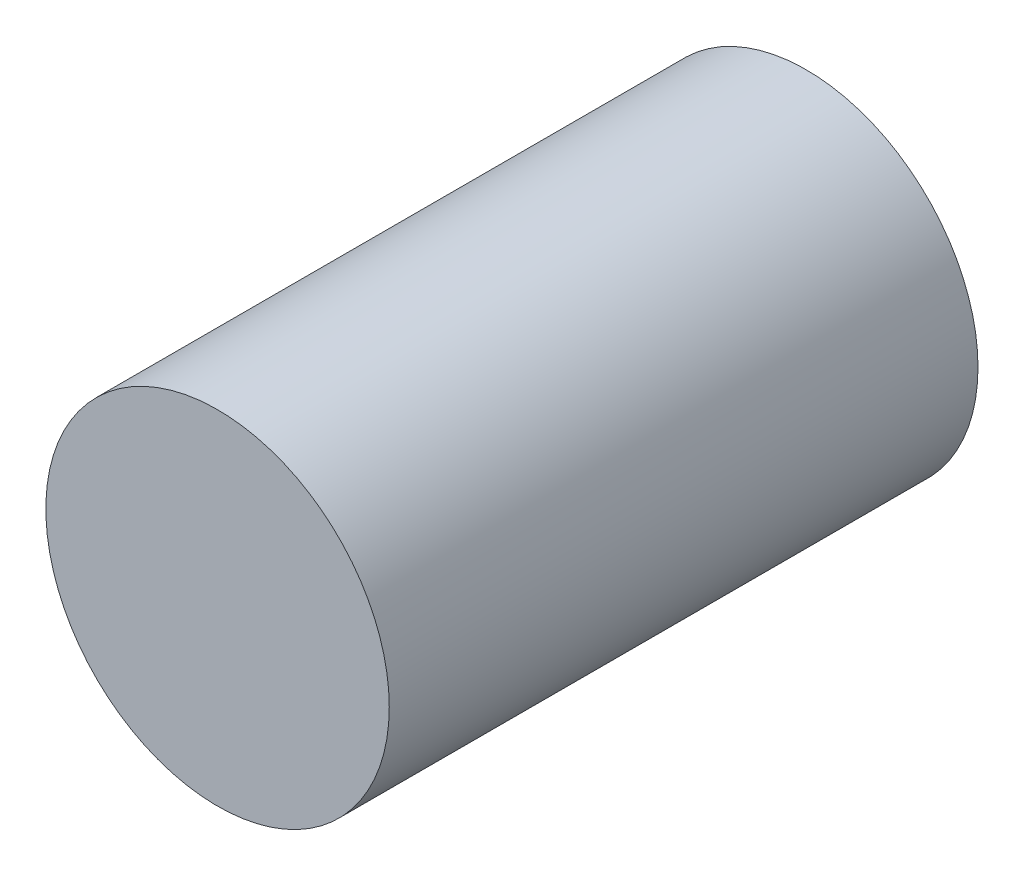
ISO-10303-21;
HEADER;
FILE_DESCRIPTION(('STEP AP214'),'2;1');
FILE_NAME('part.step','',(''),(''),'','','');
FILE_SCHEMA(('AUTOMOTIVE_DESIGN { 1 0 10303 214 1 1 1 1 }'));
ENDSEC;
DATA;
#1=APPLICATION_CONTEXT('core data for automotive mechanical design processes');
#2=APPLICATION_PROTOCOL_DEFINITION('international standard','automotive_design',2000,#1);
#3=PRODUCT_CONTEXT('',#1,'mechanical');
#4=PRODUCT('Part','Part','',(#3));
#5=PRODUCT_RELATED_PRODUCT_CATEGORY('part','',(#4));
#6=PRODUCT_DEFINITION_FORMATION('','',#4);
#7=PRODUCT_DEFINITION_CONTEXT('part definition',#1,'design');
#8=PRODUCT_DEFINITION('design','',#6,#7);
#9=PRODUCT_DEFINITION_SHAPE('','',#8);
#10=(LENGTH_UNIT() NAMED_UNIT(*) SI_UNIT(.MILLI.,.METRE.));
#11=(NAMED_UNIT(*) PLANE_ANGLE_UNIT() SI_UNIT($,.RADIAN.));
#12=(NAMED_UNIT(*) SI_UNIT($,.STERADIAN.) SOLID_ANGLE_UNIT());
#13=UNCERTAINTY_MEASURE_WITH_UNIT(LENGTH_MEASURE(1.E-05),#10,'distance_accuracy_value','');
#14=(GEOMETRIC_REPRESENTATION_CONTEXT(3) GLOBAL_UNCERTAINTY_ASSIGNED_CONTEXT((#13)) GLOBAL_UNIT_ASSIGNED_CONTEXT((#10,
#11,#12)) REPRESENTATION_CONTEXT('',''));
#15=CARTESIAN_POINT('',(0.,0.,0.));
#16=DIRECTION('',(0.,0.,1.));
#17=DIRECTION('',(1.,0.,0.));
#18=AXIS2_PLACEMENT_3D('',#15,#16,#17);
#19=CARTESIAN_POINT('',(0.,0.,24.));
#20=DIRECTION('',(0.,0.,-1.));
#21=DIRECTION('',(-1.,0.,0.));
#22=AXIS2_PLACEMENT_3D('',#19,#20,#21);
#23=CYLINDRICAL_SURFACE('',#22,7.);
#24=CARTESIAN_POINT('',(0.,0.,24.));
#25=DIRECTION('',(0.,0.,1.));
#26=DIRECTION('',(1.,0.,0.));
#27=AXIS2_PLACEMENT_3D('',#24,#25,#26);
#28=CIRCLE('',#27,7.);
#29=CARTESIAN_POINT('',(7.,0.,24.));
#30=VERTEX_POINT('',#29);
#31=EDGE_CURVE('E10',#30,#30,#28,.T.);
#32=ORIENTED_EDGE('',*,*,#31,.F.);
#33=EDGE_LOOP('',(#32));
#34=FACE_BOUND('',#33,.T.);
#35=CARTESIAN_POINT('',(0.,0.,0.));
#36=DIRECTION('',(0.,0.,1.));
#37=DIRECTION('',(1.,0.,0.));
#38=AXIS2_PLACEMENT_3D('',#35,#36,#37);
#39=CIRCLE('',#38,7.);
#40=CARTESIAN_POINT('',(7.,0.,0.));
#41=VERTEX_POINT('',#40);
#42=EDGE_CURVE('E34',#41,#41,#39,.T.);
#43=ORIENTED_EDGE('',*,*,#42,.T.);
#44=EDGE_LOOP('',(#43));
#45=FACE_BOUND('',#44,.T.);
#46=ADVANCED_FACE('F31',(#34,#45),#23,.T.);
#47=CARTESIAN_POINT('',(0.,0.,24.));
#48=DIRECTION('',(0.,0.,1.));
#49=DIRECTION('',(1.,0.,0.));
#50=AXIS2_PLACEMENT_3D('',#47,#48,#49);
#51=PLANE('',#50);
#52=ORIENTED_EDGE('',*,*,#31,.T.);
#53=EDGE_LOOP('',(#52));
#54=FACE_BOUND('',#53,.T.);
#55=ADVANCED_FACE('F46',(#54),#51,.T.);
#56=CARTESIAN_POINT('',(0.,0.,0.));
#57=DIRECTION('',(0.,0.,1.));
#58=DIRECTION('',(1.,0.,0.));
#59=AXIS2_PLACEMENT_3D('',#56,#57,#58);
#60=PLANE('',#59);
#61=ORIENTED_EDGE('',*,*,#42,.F.);
#62=EDGE_LOOP('',(#61));
#63=FACE_BOUND('',#62,.T.);
#64=ADVANCED_FACE('F44',(#63),#60,.F.);
#65=CLOSED_SHELL('',(#46,#55,#64));
#66=MANIFOLD_SOLID_BREP('B2',#65);
#67=ADVANCED_BREP_SHAPE_REPRESENTATION('',(#18,#66),#14);
#68=SHAPE_DEFINITION_REPRESENTATION(#9,#67);
ENDSEC;
END-ISO-10303-21;
